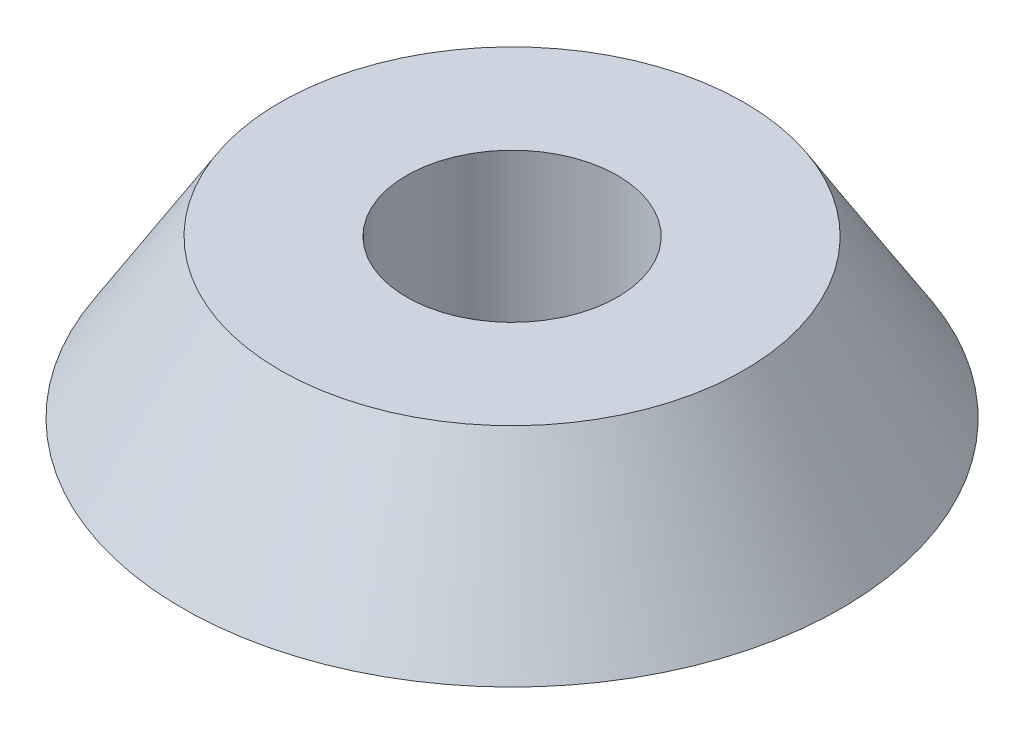
ISO-10303-21;
HEADER;
FILE_DESCRIPTION(('STEP AP214'),'2;1');
FILE_NAME('part.step','',(''),(''),'','','');
FILE_SCHEMA(('AUTOMOTIVE_DESIGN { 1 0 10303 214 1 1 1 1 }'));
ENDSEC;
DATA;
#1=APPLICATION_CONTEXT('core data for automotive mechanical design processes');
#2=APPLICATION_PROTOCOL_DEFINITION('international standard','automotive_design',2000,#1);
#3=PRODUCT_CONTEXT('',#1,'mechanical');
#4=PRODUCT('Part','Part','',(#3));
#5=PRODUCT_RELATED_PRODUCT_CATEGORY('part','',(#4));
#6=PRODUCT_DEFINITION_FORMATION('','',#4);
#7=PRODUCT_DEFINITION_CONTEXT('part definition',#1,'design');
#8=PRODUCT_DEFINITION('design','',#6,#7);
#9=PRODUCT_DEFINITION_SHAPE('','',#8);
#10=(LENGTH_UNIT() NAMED_UNIT(*) SI_UNIT(.MILLI.,.METRE.));
#11=(NAMED_UNIT(*) PLANE_ANGLE_UNIT() SI_UNIT($,.RADIAN.));
#12=(NAMED_UNIT(*) SI_UNIT($,.STERADIAN.) SOLID_ANGLE_UNIT());
#13=UNCERTAINTY_MEASURE_WITH_UNIT(LENGTH_MEASURE(1.E-05),#10,'distance_accuracy_value','');
#14=(GEOMETRIC_REPRESENTATION_CONTEXT(3) GLOBAL_UNCERTAINTY_ASSIGNED_CONTEXT((#13)) GLOBAL_UNIT_ASSIGNED_CONTEXT((#10,
#11,#12)) REPRESENTATION_CONTEXT('',''));
#15=CARTESIAN_POINT('',(0.,0.,0.));
#16=DIRECTION('',(0.,0.,1.));
#17=DIRECTION('',(1.,0.,0.));
#18=AXIS2_PLACEMENT_3D('',#15,#16,#17);
#19=CARTESIAN_POINT('',(0.,0.,0.));
#20=DIRECTION('',(0.,-1.,0.));
#21=DIRECTION('',(0.,0.,-1.));
#22=AXIS2_PLACEMENT_3D('',#19,#20,#21);
#23=CONICAL_SURFACE('',#22,10.25,0.554995727338587);
#24=CARTESIAN_POINT('',(0.,5.,0.));
#25=DIRECTION('',(0.,-1.,0.));
#26=DIRECTION('',(0.,0.,-1.));
#27=AXIS2_PLACEMENT_3D('',#24,#25,#26);
#28=CIRCLE('',#27,7.15);
#29=CARTESIAN_POINT('',(0.,5.,-7.15));
#30=VERTEX_POINT('',#29);
#31=EDGE_CURVE('E10',#30,#30,#28,.T.);
#32=ORIENTED_EDGE('',*,*,#31,.T.);
#33=EDGE_LOOP('',(#32));
#34=FACE_BOUND('',#33,.T.);
#35=CARTESIAN_POINT('',(0.,0.15,0.));
#36=DIRECTION('',(0.,-1.,0.));
#37=DIRECTION('',(0.,0.,-1.));
#38=AXIS2_PLACEMENT_3D('',#35,#36,#37);
#39=CIRCLE('',#38,10.157);
#40=CARTESIAN_POINT('',(0.,0.15,-10.157));
#41=VERTEX_POINT('',#40);
#42=EDGE_CURVE('E49',#41,#41,#39,.F.);
#43=ORIENTED_EDGE('',*,*,#42,.T.);
#44=EDGE_LOOP('',(#43));
#45=FACE_BOUND('',#44,.T.);
#46=ADVANCED_FACE('F39',(#34,#45),#23,.T.);
#47=CARTESIAN_POINT('',(0.,0.,0.));
#48=DIRECTION('',(0.,-1.,0.));
#49=DIRECTION('',(0.,0.,-1.));
#50=AXIS2_PLACEMENT_3D('',#47,#48,#49);
#51=CYLINDRICAL_SURFACE('',#50,3.25);
#52=CARTESIAN_POINT('',(0.,5.,0.));
#53=DIRECTION('',(0.,-1.,0.));
#54=DIRECTION('',(0.,0.,-1.));
#55=AXIS2_PLACEMENT_3D('',#52,#53,#54);
#56=CIRCLE('',#55,3.25);
#57=CARTESIAN_POINT('',(0.,5.,-3.25));
#58=VERTEX_POINT('',#57);
#59=EDGE_CURVE('E45',#58,#58,#56,.T.);
#60=ORIENTED_EDGE('',*,*,#59,.F.);
#61=EDGE_LOOP('',(#60));
#62=FACE_BOUND('',#61,.T.);
#63=CARTESIAN_POINT('',(0.,0.15,0.));
#64=DIRECTION('',(0.,-1.,0.));
#65=DIRECTION('',(0.,0.,-1.));
#66=AXIS2_PLACEMENT_3D('',#63,#64,#65);
#67=CIRCLE('',#66,3.25);
#68=CARTESIAN_POINT('',(0.,0.15,-3.25));
#69=VERTEX_POINT('',#68);
#70=EDGE_CURVE('E53',#69,#69,#67,.T.);
#71=ORIENTED_EDGE('',*,*,#70,.T.);
#72=EDGE_LOOP('',(#71));
#73=FACE_BOUND('',#72,.T.);
#74=ADVANCED_FACE('F59',(#62,#73),#51,.F.);
#75=CARTESIAN_POINT('',(3.25,5.,0.));
#76=DIRECTION('',(0.,1.,0.));
#77=DIRECTION('',(0.,0.,1.));
#78=AXIS2_PLACEMENT_3D('',#75,#76,#77);
#79=PLANE('',#78);
#80=ORIENTED_EDGE('',*,*,#59,.T.);
#81=EDGE_LOOP('',(#80));
#82=FACE_BOUND('',#81,.T.);
#83=ORIENTED_EDGE('',*,*,#31,.F.);
#84=EDGE_LOOP('',(#83));
#85=FACE_BOUND('',#84,.T.);
#86=ADVANCED_FACE('F63',(#82,#85),#79,.T.);
#87=CARTESIAN_POINT('',(0.,0.15,0.));
#88=DIRECTION('',(0.,-1.,0.));
#89=DIRECTION('',(0.,0.,-1.));
#90=AXIS2_PLACEMENT_3D('',#87,#88,#89);
#91=PLANE('',#90);
#92=ORIENTED_EDGE('',*,*,#42,.F.);
#93=EDGE_LOOP('',(#92));
#94=FACE_BOUND('',#93,.T.);
#95=ORIENTED_EDGE('',*,*,#70,.F.);
#96=EDGE_LOOP('',(#95));
#97=FACE_BOUND('',#96,.T.);
#98=ADVANCED_FACE('F61',(#94,#97),#91,.T.);
#99=CLOSED_SHELL('',(#46,#74,#86,#98));
#100=MANIFOLD_SOLID_BREP('B2',#99);
#101=ADVANCED_BREP_SHAPE_REPRESENTATION('',(#18,#100),#14);
#102=SHAPE_DEFINITION_REPRESENTATION(#9,#101);
ENDSEC;
END-ISO-10303-21;
